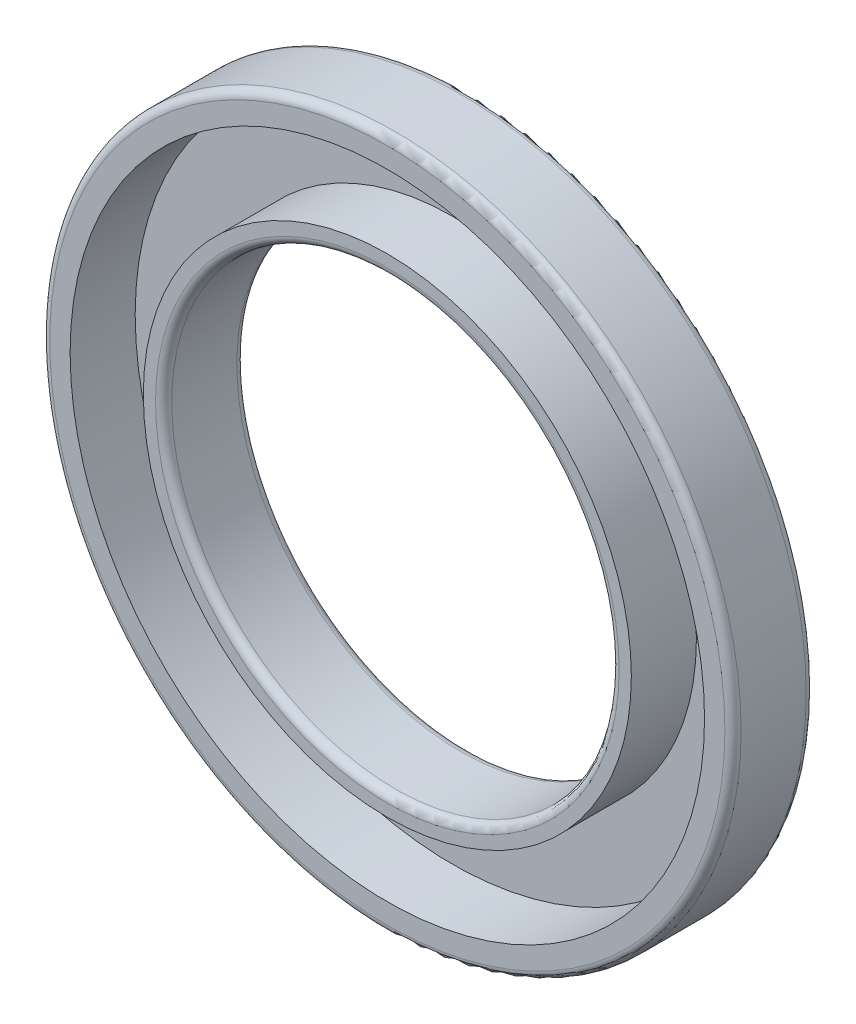
ISO-10303-21;
HEADER;
FILE_DESCRIPTION(('STEP AP214'),'2;1');
FILE_NAME('part.step','',(''),(''),'','','');
FILE_SCHEMA(('AUTOMOTIVE_DESIGN { 1 0 10303 214 1 1 1 1 }'));
ENDSEC;
DATA;
#1=APPLICATION_CONTEXT('core data for automotive mechanical design processes');
#2=APPLICATION_PROTOCOL_DEFINITION('international standard','automotive_design',2000,#1);
#3=PRODUCT_CONTEXT('',#1,'mechanical');
#4=PRODUCT('Part','Part','',(#3));
#5=PRODUCT_RELATED_PRODUCT_CATEGORY('part','',(#4));
#6=PRODUCT_DEFINITION_FORMATION('','',#4);
#7=PRODUCT_DEFINITION_CONTEXT('part definition',#1,'design');
#8=PRODUCT_DEFINITION('design','',#6,#7);
#9=PRODUCT_DEFINITION_SHAPE('','',#8);
#10=(LENGTH_UNIT() NAMED_UNIT(*) SI_UNIT(.MILLI.,.METRE.));
#11=(NAMED_UNIT(*) PLANE_ANGLE_UNIT() SI_UNIT($,.RADIAN.));
#12=(NAMED_UNIT(*) SI_UNIT($,.STERADIAN.) SOLID_ANGLE_UNIT());
#13=UNCERTAINTY_MEASURE_WITH_UNIT(LENGTH_MEASURE(1.E-05),#10,'distance_accuracy_value','');
#14=(GEOMETRIC_REPRESENTATION_CONTEXT(3) GLOBAL_UNCERTAINTY_ASSIGNED_CONTEXT((#13)) GLOBAL_UNIT_ASSIGNED_CONTEXT((#10,
#11,#12)) REPRESENTATION_CONTEXT('',''));
#15=CARTESIAN_POINT('',(0.,0.,0.));
#16=DIRECTION('',(0.,0.,1.));
#17=DIRECTION('',(1.,0.,0.));
#18=AXIS2_PLACEMENT_3D('',#15,#16,#17);
#19=CARTESIAN_POINT('',(0.,0.,10.));
#20=DIRECTION('',(0.,0.,1.));
#21=DIRECTION('',(1.,0.,0.));
#22=AXIS2_PLACEMENT_3D('',#19,#20,#21);
#23=PLANE('',#22);
#24=CARTESIAN_POINT('',(0.,0.,10.));
#25=DIRECTION('',(0.,0.,1.));
#26=DIRECTION('',(1.,0.,0.));
#27=AXIS2_PLACEMENT_3D('',#24,#25,#26);
#28=CIRCLE('',#27,28.5);
#29=CARTESIAN_POINT('',(28.5,0.,10.));
#30=VERTEX_POINT('',#29);
#31=EDGE_CURVE('E46',#30,#30,#28,.F.);
#32=ORIENTED_EDGE('',*,*,#31,.T.);
#33=EDGE_LOOP('',(#32));
#34=FACE_BOUND('',#33,.T.);
#35=CARTESIAN_POINT('',(0.,0.,10.));
#36=DIRECTION('',(0.,0.,1.));
#37=DIRECTION('',(1.,0.,0.));
#38=AXIS2_PLACEMENT_3D('',#35,#36,#37);
#39=CIRCLE('',#38,30.);
#40=CARTESIAN_POINT('',(30.,0.,10.));
#41=VERTEX_POINT('',#40);
#42=EDGE_CURVE('E70',#41,#41,#39,.T.);
#43=ORIENTED_EDGE('',*,*,#42,.T.);
#44=EDGE_LOOP('',(#43));
#45=FACE_BOUND('',#44,.T.);
#46=ADVANCED_FACE('F31',(#34,#45),#23,.T.);
#47=CARTESIAN_POINT('',(0.,0.,10.));
#48=DIRECTION('',(0.,0.,1.));
#49=DIRECTION('',(1.,0.,0.));
#50=AXIS2_PLACEMENT_3D('',#47,#48,#49);
#51=CIRCLE('',#50,41.5);
#52=CARTESIAN_POINT('',(41.5,0.,10.));
#53=VERTEX_POINT('',#52);
#54=EDGE_CURVE('E42',#53,#53,#51,.T.);
#55=ORIENTED_EDGE('',*,*,#54,.T.);
#56=EDGE_LOOP('',(#55));
#57=FACE_BOUND('',#56,.T.);
#58=CARTESIAN_POINT('',(0.,0.,10.));
#59=DIRECTION('',(0.,0.,1.));
#60=DIRECTION('',(1.,0.,0.));
#61=AXIS2_PLACEMENT_3D('',#58,#59,#60);
#62=CIRCLE('',#61,39.);
#63=CARTESIAN_POINT('',(39.,0.,10.));
#64=VERTEX_POINT('',#63);
#65=EDGE_CURVE('E64',#64,#64,#62,.T.);
#66=ORIENTED_EDGE('',*,*,#65,.F.);
#67=EDGE_LOOP('',(#66));
#68=FACE_BOUND('',#67,.T.);
#69=ADVANCED_FACE('F92',(#57,#68),#23,.T.);
#70=CARTESIAN_POINT('',(0.,0.,0.));
#71=DIRECTION('',(0.,0.,1.));
#72=DIRECTION('',(1.,0.,0.));
#73=AXIS2_PLACEMENT_3D('',#70,#71,#72);
#74=PLANE('',#73);
#75=CARTESIAN_POINT('',(0.,0.,0.));
#76=DIRECTION('',(0.,0.,1.));
#77=DIRECTION('',(1.,0.,0.));
#78=AXIS2_PLACEMENT_3D('',#75,#76,#77);
#79=CIRCLE('',#78,28.5);
#80=CARTESIAN_POINT('',(28.5,0.,0.));
#81=VERTEX_POINT('',#80);
#82=EDGE_CURVE('E57',#81,#81,#79,.T.);
#83=ORIENTED_EDGE('',*,*,#82,.T.);
#84=EDGE_LOOP('',(#83));
#85=FACE_BOUND('',#84,.T.);
#86=CARTESIAN_POINT('',(0.,0.,0.));
#87=DIRECTION('',(0.,0.,1.));
#88=DIRECTION('',(1.,0.,0.));
#89=AXIS2_PLACEMENT_3D('',#86,#87,#88);
#90=CIRCLE('',#89,41.5);
#91=CARTESIAN_POINT('',(41.5,0.,0.));
#92=VERTEX_POINT('',#91);
#93=EDGE_CURVE('E60',#92,#92,#90,.F.);
#94=ORIENTED_EDGE('',*,*,#93,.T.);
#95=EDGE_LOOP('',(#94));
#96=FACE_BOUND('',#95,.T.);
#97=ADVANCED_FACE('F94',(#85,#96),#74,.F.);
#98=CARTESIAN_POINT('',(0.,0.,10.));
#99=DIRECTION('',(0.,0.,-1.));
#100=DIRECTION('',(-1.,0.,0.));
#101=AXIS2_PLACEMENT_3D('',#98,#99,#100);
#102=CYLINDRICAL_SURFACE('',#101,42.5);
#103=CARTESIAN_POINT('',(0.,0.,9.));
#104=DIRECTION('',(0.,0.,1.));
#105=DIRECTION('',(1.,0.,0.));
#106=AXIS2_PLACEMENT_3D('',#103,#104,#105);
#107=CIRCLE('',#106,42.5);
#108=CARTESIAN_POINT('',(42.5,0.,9.));
#109=VERTEX_POINT('',#108);
#110=EDGE_CURVE('E10',#109,#109,#107,.F.);
#111=ORIENTED_EDGE('',*,*,#110,.T.);
#112=EDGE_LOOP('',(#111));
#113=FACE_BOUND('',#112,.T.);
#114=CARTESIAN_POINT('',(0.,0.,0.999999999999999));
#115=DIRECTION('',(0.,0.,1.));
#116=DIRECTION('',(1.,0.,0.));
#117=AXIS2_PLACEMENT_3D('',#114,#115,#116);
#118=CIRCLE('',#117,42.5);
#119=CARTESIAN_POINT('',(42.5,0.,0.999999999999999));
#120=VERTEX_POINT('',#119);
#121=EDGE_CURVE('E38',#120,#120,#118,.T.);
#122=ORIENTED_EDGE('',*,*,#121,.T.);
#123=EDGE_LOOP('',(#122));
#124=FACE_BOUND('',#123,.T.);
#125=ADVANCED_FACE('F101',(#113,#124),#102,.T.);
#126=CARTESIAN_POINT('',(0.,0.,10.));
#127=DIRECTION('',(0.,0.,-1.));
#128=DIRECTION('',(-1.,0.,0.));
#129=AXIS2_PLACEMENT_3D('',#126,#127,#128);
#130=CYLINDRICAL_SURFACE('',#129,27.5);
#131=CARTESIAN_POINT('',(0.,0.,0.999999999999999));
#132=DIRECTION('',(0.,0.,1.));
#133=DIRECTION('',(1.,0.,0.));
#134=AXIS2_PLACEMENT_3D('',#131,#132,#133);
#135=CIRCLE('',#134,27.5);
#136=CARTESIAN_POINT('',(27.5,0.,0.999999999999999));
#137=VERTEX_POINT('',#136);
#138=EDGE_CURVE('E51',#137,#137,#135,.F.);
#139=ORIENTED_EDGE('',*,*,#138,.T.);
#140=EDGE_LOOP('',(#139));
#141=FACE_BOUND('',#140,.T.);
#142=CARTESIAN_POINT('',(0.,0.,9.));
#143=DIRECTION('',(0.,0.,1.));
#144=DIRECTION('',(1.,0.,0.));
#145=AXIS2_PLACEMENT_3D('',#142,#143,#144);
#146=CIRCLE('',#145,27.5);
#147=CARTESIAN_POINT('',(27.5,0.,9.));
#148=VERTEX_POINT('',#147);
#149=EDGE_CURVE('E54',#148,#148,#146,.T.);
#150=ORIENTED_EDGE('',*,*,#149,.T.);
#151=EDGE_LOOP('',(#150));
#152=FACE_BOUND('',#151,.T.);
#153=ADVANCED_FACE('F88',(#141,#152),#130,.F.);
#154=CARTESIAN_POINT('',(0.,0.,2.));
#155=DIRECTION('',(0.,0.,1.));
#156=DIRECTION('',(1.,0.,0.));
#157=AXIS2_PLACEMENT_3D('',#154,#155,#156);
#158=CYLINDRICAL_SURFACE('',#157,39.);
#159=CARTESIAN_POINT('',(0.,0.,2.));
#160=DIRECTION('',(0.,0.,1.));
#161=DIRECTION('',(1.,0.,0.));
#162=AXIS2_PLACEMENT_3D('',#159,#160,#161);
#163=CIRCLE('',#162,39.);
#164=CARTESIAN_POINT('',(39.,0.,2.));
#165=VERTEX_POINT('',#164);
#166=EDGE_CURVE('E63',#165,#165,#163,.T.);
#167=ORIENTED_EDGE('',*,*,#166,.F.);
#168=EDGE_LOOP('',(#167));
#169=FACE_BOUND('',#168,.T.);
#170=ORIENTED_EDGE('',*,*,#65,.T.);
#171=EDGE_LOOP('',(#170));
#172=FACE_BOUND('',#171,.T.);
#173=ADVANCED_FACE('F82',(#169,#172),#158,.F.);
#174=CARTESIAN_POINT('',(0.,0.,2.));
#175=DIRECTION('',(0.,0.,1.));
#176=DIRECTION('',(1.,0.,0.));
#177=AXIS2_PLACEMENT_3D('',#174,#175,#176);
#178=PLANE('',#177);
#179=CARTESIAN_POINT('',(0.,0.,2.));
#180=DIRECTION('',(0.,0.,1.));
#181=DIRECTION('',(1.,0.,0.));
#182=AXIS2_PLACEMENT_3D('',#179,#180,#181);
#183=CIRCLE('',#182,30.);
#184=CARTESIAN_POINT('',(30.,0.,2.));
#185=VERTEX_POINT('',#184);
#186=EDGE_CURVE('E67',#185,#185,#183,.T.);
#187=ORIENTED_EDGE('',*,*,#186,.F.);
#188=EDGE_LOOP('',(#187));
#189=FACE_BOUND('',#188,.T.);
#190=ORIENTED_EDGE('',*,*,#166,.T.);
#191=EDGE_LOOP('',(#190));
#192=FACE_BOUND('',#191,.T.);
#193=ADVANCED_FACE('F79',(#189,#192),#178,.T.);
#194=CARTESIAN_POINT('',(0.,0.,2.));
#195=DIRECTION('',(0.,0.,1.));
#196=DIRECTION('',(1.,0.,0.));
#197=AXIS2_PLACEMENT_3D('',#194,#195,#196);
#198=CYLINDRICAL_SURFACE('',#197,30.);
#199=ORIENTED_EDGE('',*,*,#186,.T.);
#200=EDGE_LOOP('',(#199));
#201=FACE_BOUND('',#200,.T.);
#202=ORIENTED_EDGE('',*,*,#42,.F.);
#203=EDGE_LOOP('',(#202));
#204=FACE_BOUND('',#203,.T.);
#205=ADVANCED_FACE('F76',(#201,#204),#198,.T.);
#206=CARTESIAN_POINT('',(0.,0.,0.999999999999999));
#207=DIRECTION('',(0.,0.,1.));
#208=DIRECTION('',(1.,0.,0.));
#209=AXIS2_PLACEMENT_3D('',#206,#207,#208);
#210=TOROIDAL_SURFACE('',#209,28.5,1.);
#211=ORIENTED_EDGE('',*,*,#138,.F.);
#212=EDGE_LOOP('',(#211));
#213=FACE_BOUND('',#212,.T.);
#214=ORIENTED_EDGE('',*,*,#82,.F.);
#215=EDGE_LOOP('',(#214));
#216=FACE_BOUND('',#215,.T.);
#217=ADVANCED_FACE('F109',(#213,#216),#210,.T.);
#218=CARTESIAN_POINT('',(0.,0.,9.));
#219=DIRECTION('',(0.,0.,1.));
#220=DIRECTION('',(1.,0.,0.));
#221=AXIS2_PLACEMENT_3D('',#218,#219,#220);
#222=TOROIDAL_SURFACE('',#221,28.5,1.);
#223=ORIENTED_EDGE('',*,*,#31,.F.);
#224=EDGE_LOOP('',(#223));
#225=FACE_BOUND('',#224,.T.);
#226=ORIENTED_EDGE('',*,*,#149,.F.);
#227=EDGE_LOOP('',(#226));
#228=FACE_BOUND('',#227,.T.);
#229=ADVANCED_FACE('F112',(#225,#228),#222,.T.);
#230=CARTESIAN_POINT('',(0.,0.,9.));
#231=DIRECTION('',(0.,0.,1.));
#232=DIRECTION('',(1.,0.,0.));
#233=AXIS2_PLACEMENT_3D('',#230,#231,#232);
#234=TOROIDAL_SURFACE('',#233,41.5,1.);
#235=ORIENTED_EDGE('',*,*,#110,.F.);
#236=EDGE_LOOP('',(#235));
#237=FACE_BOUND('',#236,.T.);
#238=ORIENTED_EDGE('',*,*,#54,.F.);
#239=EDGE_LOOP('',(#238));
#240=FACE_BOUND('',#239,.T.);
#241=ADVANCED_FACE('F115',(#237,#240),#234,.T.);
#242=CARTESIAN_POINT('',(0.,0.,0.999999999999999));
#243=DIRECTION('',(0.,0.,1.));
#244=DIRECTION('',(1.,0.,0.));
#245=AXIS2_PLACEMENT_3D('',#242,#243,#244);
#246=TOROIDAL_SURFACE('',#245,41.5,1.);
#247=ORIENTED_EDGE('',*,*,#93,.F.);
#248=EDGE_LOOP('',(#247));
#249=FACE_BOUND('',#248,.T.);
#250=ORIENTED_EDGE('',*,*,#121,.F.);
#251=EDGE_LOOP('',(#250));
#252=FACE_BOUND('',#251,.T.);
#253=ADVANCED_FACE('F33',(#249,#252),#246,.T.);
#254=CLOSED_SHELL('',(#46,#69,#97,#125,#153,#173,#193,#205,#217,#229,#241,#253));
#255=MANIFOLD_SOLID_BREP('B2',#254);
#256=ADVANCED_BREP_SHAPE_REPRESENTATION('',(#18,#255),#14);
#257=SHAPE_DEFINITION_REPRESENTATION(#9,#256);
ENDSEC;
END-ISO-10303-21;
